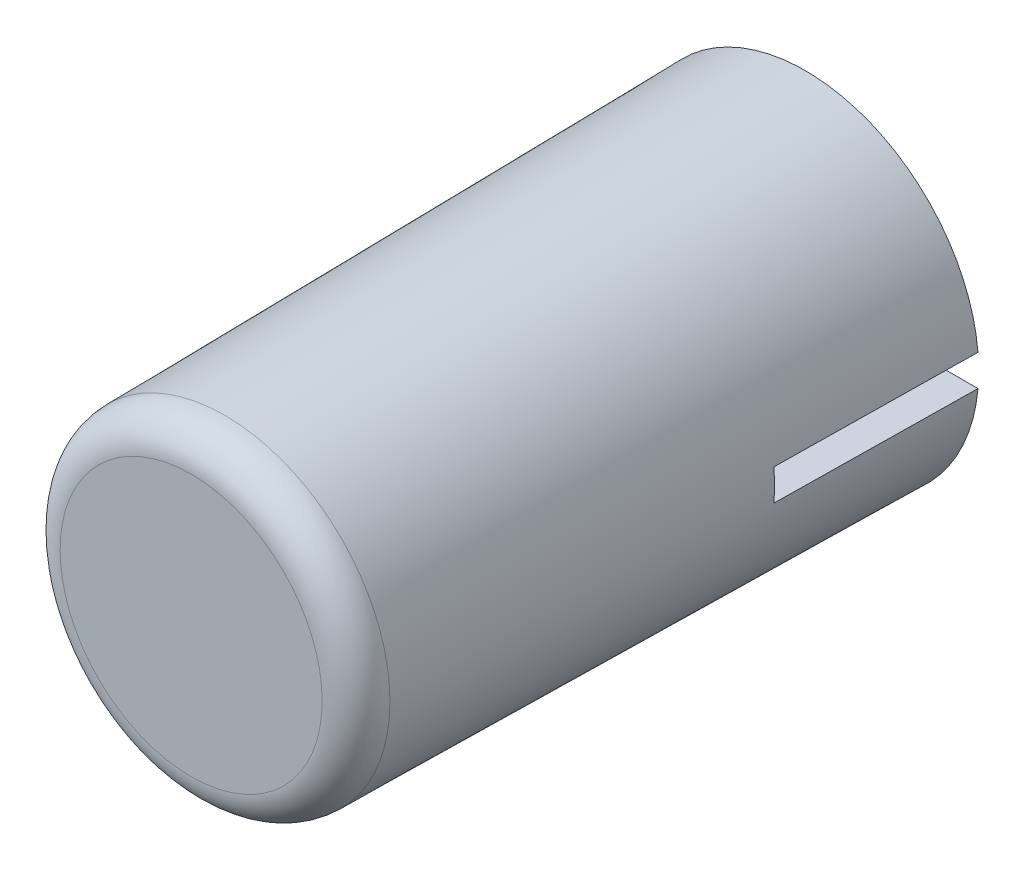
ISO-10303-21;
HEADER;
FILE_DESCRIPTION(('STEP AP214'),'2;1');
FILE_NAME('part.step','',(''),(''),'','','');
FILE_SCHEMA(('AUTOMOTIVE_DESIGN { 1 0 10303 214 1 1 1 1 }'));
ENDSEC;
DATA;
#1=APPLICATION_CONTEXT('core data for automotive mechanical design processes');
#2=APPLICATION_PROTOCOL_DEFINITION('international standard','automotive_design',2000,#1);
#3=PRODUCT_CONTEXT('',#1,'mechanical');
#4=PRODUCT('Part','Part','',(#3));
#5=PRODUCT_RELATED_PRODUCT_CATEGORY('part','',(#4));
#6=PRODUCT_DEFINITION_FORMATION('','',#4);
#7=PRODUCT_DEFINITION_CONTEXT('part definition',#1,'design');
#8=PRODUCT_DEFINITION('design','',#6,#7);
#9=PRODUCT_DEFINITION_SHAPE('','',#8);
#10=(LENGTH_UNIT() NAMED_UNIT(*) SI_UNIT(.MILLI.,.METRE.));
#11=(NAMED_UNIT(*) PLANE_ANGLE_UNIT() SI_UNIT($,.RADIAN.));
#12=(NAMED_UNIT(*) SI_UNIT($,.STERADIAN.) SOLID_ANGLE_UNIT());
#13=UNCERTAINTY_MEASURE_WITH_UNIT(LENGTH_MEASURE(1.E-05),#10,'distance_accuracy_value','');
#14=(GEOMETRIC_REPRESENTATION_CONTEXT(3) GLOBAL_UNCERTAINTY_ASSIGNED_CONTEXT((#13)) GLOBAL_UNIT_ASSIGNED_CONTEXT((#10,
#11,#12)) REPRESENTATION_CONTEXT('',''));
#15=CARTESIAN_POINT('',(0.,0.,0.));
#16=DIRECTION('',(0.,0.,1.));
#17=DIRECTION('',(1.,0.,0.));
#18=AXIS2_PLACEMENT_3D('',#15,#16,#17);
#19=CARTESIAN_POINT('',(0.,1.3335,1.2446));
#20=DIRECTION('',(0.,-1.,0.));
#21=DIRECTION('',(0.,0.,-1.));
#22=AXIS2_PLACEMENT_3D('',#19,#20,#21);
#23=PLANE('',#22);
#24=DIRECTION('',(0.,0.,-1.));
#25=VECTOR('',#24,1.);
#26=CARTESIAN_POINT('',(-1.4224,1.3335,1.2446));
#27=LINE('',#26,#25);
#28=CARTESIAN_POINT('',(-1.4224,1.3335,1.7526));
#29=VERTEX_POINT('',#28);
#30=CARTESIAN_POINT('',(-1.4224,1.3335,1.2446));
#31=VERTEX_POINT('',#30);
#32=EDGE_CURVE('E168',#29,#31,#27,.T.);
#33=ORIENTED_EDGE('',*,*,#32,.T.);
#34=DIRECTION('',(1.,0.,0.));
#35=VECTOR('',#34,1.);
#36=CARTESIAN_POINT('',(0.,1.3335,1.2446));
#37=LINE('',#36,#35);
#38=CARTESIAN_POINT('',(1.4224,1.3335,1.2446));
#39=VERTEX_POINT('',#38);
#40=EDGE_CURVE('E165',#39,#31,#37,.F.);
#41=ORIENTED_EDGE('',*,*,#40,.F.);
#42=DIRECTION('',(0.,0.,-1.));
#43=VECTOR('',#42,1.);
#44=CARTESIAN_POINT('',(1.4224,1.3335,1.2446));
#45=LINE('',#44,#43);
#46=CARTESIAN_POINT('',(1.4224,1.3335,1.7526));
#47=VERTEX_POINT('',#46);
#48=EDGE_CURVE('E147',#39,#47,#45,.F.);
#49=ORIENTED_EDGE('',*,*,#48,.T.);
#50=DIRECTION('',(1.,0.,0.));
#51=VECTOR('',#50,1.);
#52=CARTESIAN_POINT('',(0.,1.3335,1.7526));
#53=LINE('',#52,#51);
#54=EDGE_CURVE('E162',#29,#47,#53,.T.);
#55=ORIENTED_EDGE('',*,*,#54,.F.);
#56=EDGE_LOOP('',(#33,#41,#49,#55));
#57=FACE_BOUND('',#56,.T.);
#58=ADVANCED_FACE('F17',(#57),#23,.T.);
#59=CARTESIAN_POINT('',(-0.8024,-0.4953,8.43));
#60=DIRECTION('',(1.,0.,0.));
#61=DIRECTION('',(0.,0.,-1.));
#62=AXIS2_PLACEMENT_3D('',#59,#60,#61);
#63=PLANE('',#62);
#64=DIRECTION('',(0.,1.,0.));
#65=VECTOR('',#64,1.);
#66=CARTESIAN_POINT('',(-0.8024,0.,8.43));
#67=LINE('',#66,#65);
#68=CARTESIAN_POINT('',(-0.8024,0.4953,8.43));
#69=VERTEX_POINT('',#68);
#70=CARTESIAN_POINT('',(-0.8024,-0.4953,8.43));
#71=VERTEX_POINT('',#70);
#72=EDGE_CURVE('E529',#69,#71,#67,.F.);
#73=ORIENTED_EDGE('',*,*,#72,.T.);
#74=DIRECTION('',(0.,0.,-1.));
#75=VECTOR('',#74,1.);
#76=CARTESIAN_POINT('',(-0.8024,-0.4953,8.43));
#77=LINE('',#76,#75);
#78=CARTESIAN_POINT('',(-0.8024,-0.4953,3.91));
#79=VERTEX_POINT('',#78);
#80=EDGE_CURVE('E514',#79,#71,#77,.F.);
#81=ORIENTED_EDGE('',*,*,#80,.F.);
#82=DIRECTION('',(0.,1.,0.));
#83=VECTOR('',#82,1.);
#84=CARTESIAN_POINT('',(-0.8024,0.,3.91));
#85=LINE('',#84,#83);
#86=CARTESIAN_POINT('',(-0.8024,0.4953,3.91));
#87=VERTEX_POINT('',#86);
#88=EDGE_CURVE('E507',#79,#87,#85,.T.);
#89=ORIENTED_EDGE('',*,*,#88,.T.);
#90=DIRECTION('',(0.,0.,1.));
#91=VECTOR('',#90,1.);
#92=CARTESIAN_POINT('',(-0.8024,0.4953,8.43));
#93=LINE('',#92,#91);
#94=EDGE_CURVE('E479',#69,#87,#93,.F.);
#95=ORIENTED_EDGE('',*,*,#94,.F.);
#96=EDGE_LOOP('',(#73,#81,#89,#95));
#97=FACE_BOUND('',#96,.T.);
#98=ADVANCED_FACE('F888',(#97),#63,.T.);
#99=CARTESIAN_POINT('',(0.,-1.3335,1.7526));
#100=DIRECTION('',(0.,1.,0.));
#101=DIRECTION('',(0.,0.,1.));
#102=AXIS2_PLACEMENT_3D('',#99,#100,#101);
#103=PLANE('',#102);
#104=DIRECTION('',(0.,0.,1.));
#105=VECTOR('',#104,1.);
#106=CARTESIAN_POINT('',(-1.4224,-1.3335,1.7526));
#107=LINE('',#106,#105);
#108=CARTESIAN_POINT('',(-1.4224,-1.3335,1.2446));
#109=VERTEX_POINT('',#108);
#110=CARTESIAN_POINT('',(-1.4224,-1.3335,1.7526));
#111=VERTEX_POINT('',#110);
#112=EDGE_CURVE('E158',#109,#111,#107,.T.);
#113=ORIENTED_EDGE('',*,*,#112,.T.);
#114=DIRECTION('',(1.,0.,0.));
#115=VECTOR('',#114,1.);
#116=CARTESIAN_POINT('',(0.,-1.3335,1.7526));
#117=LINE('',#116,#115);
#118=CARTESIAN_POINT('',(1.4224,-1.3335,1.7526));
#119=VERTEX_POINT('',#118);
#120=EDGE_CURVE('E570',#119,#111,#117,.F.);
#121=ORIENTED_EDGE('',*,*,#120,.F.);
#122=DIRECTION('',(0.,0.,1.));
#123=VECTOR('',#122,1.);
#124=CARTESIAN_POINT('',(1.4224,-1.3335,1.7526));
#125=LINE('',#124,#123);
#126=CARTESIAN_POINT('',(1.4224,-1.3335,1.2446));
#127=VERTEX_POINT('',#126);
#128=EDGE_CURVE('E549',#119,#127,#125,.F.);
#129=ORIENTED_EDGE('',*,*,#128,.T.);
#130=DIRECTION('',(1.,0.,0.));
#131=VECTOR('',#130,1.);
#132=CARTESIAN_POINT('',(0.,-1.3335,1.2446));
#133=LINE('',#132,#131);
#134=EDGE_CURVE('E465',#109,#127,#133,.T.);
#135=ORIENTED_EDGE('',*,*,#134,.F.);
#136=EDGE_LOOP('',(#113,#121,#129,#135));
#137=FACE_BOUND('',#136,.T.);
#138=ADVANCED_FACE('F881',(#137),#103,.T.);
#139=CARTESIAN_POINT('',(0.,1.3335,1.7526));
#140=DIRECTION('',(0.,-0.342020143325671,0.939692620785908));
#141=DIRECTION('',(0.,-0.939692620785908,-0.342020143325671));
#142=AXIS2_PLACEMENT_3D('',#139,#140,#141);
#143=PLANE('',#142);
#144=DIRECTION('',(0.,-0.939692620785908,-0.342020143325671));
#145=VECTOR('',#144,1.);
#146=CARTESIAN_POINT('',(-1.4224,1.3335,1.7526));
#147=LINE('',#146,#145);
#148=CARTESIAN_POINT('',(-1.4224,1.4224,1.78495695382627));
#149=VERTEX_POINT('',#148);
#150=EDGE_CURVE('E157',#149,#29,#147,.T.);
#151=ORIENTED_EDGE('',*,*,#150,.T.);
#152=ORIENTED_EDGE('',*,*,#54,.T.);
#153=DIRECTION('',(0.,-0.939692620785908,-0.342020143325671));
#154=VECTOR('',#153,1.);
#155=CARTESIAN_POINT('',(1.4224,1.3335,1.7526));
#156=LINE('',#155,#154);
#157=CARTESIAN_POINT('',(1.4224,1.4224,1.78495695382627));
#158=VERTEX_POINT('',#157);
#159=EDGE_CURVE('E144',#47,#158,#156,.F.);
#160=ORIENTED_EDGE('',*,*,#159,.T.);
#161=DIRECTION('',(1.,0.,0.));
#162=VECTOR('',#161,1.);
#163=CARTESIAN_POINT('',(-1.4224,1.4224,1.78495695382627));
#164=LINE('',#163,#162);
#165=EDGE_CURVE('E458',#158,#149,#164,.F.);
#166=ORIENTED_EDGE('',*,*,#165,.T.);
#167=EDGE_LOOP('',(#151,#152,#160,#166));
#168=FACE_BOUND('',#167,.T.);
#169=ADVANCED_FACE('F170',(#168),#143,.T.);
#170=CARTESIAN_POINT('',(0.8024,0.4953,8.43));
#171=DIRECTION('',(-1.,0.,0.));
#172=DIRECTION('',(0.,0.,1.));
#173=AXIS2_PLACEMENT_3D('',#170,#171,#172);
#174=PLANE('',#173);
#175=DIRECTION('',(0.,1.,0.));
#176=VECTOR('',#175,1.);
#177=CARTESIAN_POINT('',(0.8024,0.,8.43));
#178=LINE('',#177,#176);
#179=CARTESIAN_POINT('',(0.8024,-0.4953,8.43));
#180=VERTEX_POINT('',#179);
#181=CARTESIAN_POINT('',(0.8024,0.4953,8.43));
#182=VERTEX_POINT('',#181);
#183=EDGE_CURVE('E540',#180,#182,#178,.T.);
#184=ORIENTED_EDGE('',*,*,#183,.T.);
#185=DIRECTION('',(0.,0.,1.));
#186=VECTOR('',#185,1.);
#187=CARTESIAN_POINT('',(0.8024,0.4953,8.43));
#188=LINE('',#187,#186);
#189=CARTESIAN_POINT('',(0.8024,0.4953,3.91));
#190=VERTEX_POINT('',#189);
#191=EDGE_CURVE('E454',#190,#182,#188,.T.);
#192=ORIENTED_EDGE('',*,*,#191,.F.);
#193=DIRECTION('',(0.,1.,0.));
#194=VECTOR('',#193,1.);
#195=CARTESIAN_POINT('',(0.8024,0.,3.91));
#196=LINE('',#195,#194);
#197=CARTESIAN_POINT('',(0.8024,-0.4953,3.91));
#198=VERTEX_POINT('',#197);
#199=EDGE_CURVE('E442',#190,#198,#196,.F.);
#200=ORIENTED_EDGE('',*,*,#199,.T.);
#201=DIRECTION('',(0.,0.,-1.));
#202=VECTOR('',#201,1.);
#203=CARTESIAN_POINT('',(0.8024,-0.4953,8.43));
#204=LINE('',#203,#202);
#205=EDGE_CURVE('E430',#180,#198,#204,.T.);
#206=ORIENTED_EDGE('',*,*,#205,.F.);
#207=EDGE_LOOP('',(#184,#192,#200,#206));
#208=FACE_BOUND('',#207,.T.);
#209=ADVANCED_FACE('F866',(#208),#174,.T.);
#210=CARTESIAN_POINT('',(0.,0.,8.43));
#211=DIRECTION('',(0.,0.,1.));
#212=DIRECTION('',(1.,0.,0.));
#213=AXIS2_PLACEMENT_3D('',#210,#211,#212);
#214=PLANE('',#213);
#215=ORIENTED_EDGE('',*,*,#72,.F.);
#216=DIRECTION('',(1.,0.,0.));
#217=VECTOR('',#216,1.);
#218=CARTESIAN_POINT('',(-0.8024,0.4953,8.43));
#219=LINE('',#218,#217);
#220=CARTESIAN_POINT('',(-1.4224,0.4953,8.43));
#221=VERTEX_POINT('',#220);
#222=EDGE_CURVE('E495',#221,#69,#219,.T.);
#223=ORIENTED_EDGE('',*,*,#222,.F.);
#224=DIRECTION('',(0.,1.,0.));
#225=VECTOR('',#224,1.);
#226=CARTESIAN_POINT('',(-1.4224,0.,8.43));
#227=LINE('',#226,#225);
#228=CARTESIAN_POINT('',(-1.4224,1.4224,8.43));
#229=VERTEX_POINT('',#228);
#230=EDGE_CURVE('E533',#229,#221,#227,.F.);
#231=ORIENTED_EDGE('',*,*,#230,.F.);
#232=DIRECTION('',(1.,0.,0.));
#233=VECTOR('',#232,1.);
#234=CARTESIAN_POINT('',(-1.4224,1.4224,8.43));
#235=LINE('',#234,#233);
#236=CARTESIAN_POINT('',(1.4224,1.4224,8.43));
#237=VERTEX_POINT('',#236);
#238=EDGE_CURVE('E461',#229,#237,#235,.T.);
#239=ORIENTED_EDGE('',*,*,#238,.T.);
#240=DIRECTION('',(0.,1.,0.));
#241=VECTOR('',#240,1.);
#242=CARTESIAN_POINT('',(1.4224,0.,8.43));
#243=LINE('',#242,#241);
#244=CARTESIAN_POINT('',(1.4224,0.4953,8.43));
#245=VERTEX_POINT('',#244);
#246=EDGE_CURVE('E537',#245,#237,#243,.T.);
#247=ORIENTED_EDGE('',*,*,#246,.F.);
#248=DIRECTION('',(1.,0.,0.));
#249=VECTOR('',#248,1.);
#250=CARTESIAN_POINT('',(1.4224,0.4953,8.43));
#251=LINE('',#250,#249);
#252=EDGE_CURVE('E450',#182,#245,#251,.T.);
#253=ORIENTED_EDGE('',*,*,#252,.F.);
#254=ORIENTED_EDGE('',*,*,#183,.F.);
#255=DIRECTION('',(1.,0.,0.));
#256=VECTOR('',#255,1.);
#257=CARTESIAN_POINT('',(0.8024,-0.4953,8.43));
#258=LINE('',#257,#256);
#259=CARTESIAN_POINT('',(1.4224,-0.4953,8.43));
#260=VERTEX_POINT('',#259);
#261=EDGE_CURVE('E434',#260,#180,#258,.F.);
#262=ORIENTED_EDGE('',*,*,#261,.F.);
#263=DIRECTION('',(0.,1.,0.));
#264=VECTOR('',#263,1.);
#265=CARTESIAN_POINT('',(1.4224,0.,8.43));
#266=LINE('',#265,#264);
#267=CARTESIAN_POINT('',(1.4224,-1.4224,8.43));
#268=VERTEX_POINT('',#267);
#269=EDGE_CURVE('E179',#268,#260,#266,.T.);
#270=ORIENTED_EDGE('',*,*,#269,.F.);
#271=DIRECTION('',(1.,0.,0.));
#272=VECTOR('',#271,1.);
#273=CARTESIAN_POINT('',(1.4224,-1.4224,8.43));
#274=LINE('',#273,#272);
#275=CARTESIAN_POINT('',(-1.4224,-1.4224,8.43));
#276=VERTEX_POINT('',#275);
#277=EDGE_CURVE('E426',#268,#276,#274,.F.);
#278=ORIENTED_EDGE('',*,*,#277,.T.);
#279=DIRECTION('',(0.,1.,0.));
#280=VECTOR('',#279,1.);
#281=CARTESIAN_POINT('',(-1.4224,0.,8.43));
#282=LINE('',#281,#280);
#283=CARTESIAN_POINT('',(-1.4224,-0.4953,8.43));
#284=VERTEX_POINT('',#283);
#285=EDGE_CURVE('E173',#284,#276,#282,.F.);
#286=ORIENTED_EDGE('',*,*,#285,.F.);
#287=DIRECTION('',(1.,0.,0.));
#288=VECTOR('',#287,1.);
#289=CARTESIAN_POINT('',(-1.4224,-0.4953,8.43));
#290=LINE('',#289,#288);
#291=EDGE_CURVE('E510',#71,#284,#290,.F.);
#292=ORIENTED_EDGE('',*,*,#291,.F.);
#293=EDGE_LOOP('',(#215,#223,#231,#239,#247,#253,#254,#262,#270,#278,#286,#292));
#294=FACE_BOUND('',#293,.T.);
#295=ADVANCED_FACE('F859',(#294),#214,.F.);
#296=CARTESIAN_POINT('',(0.,-1.4224,1.78495695382627));
#297=DIRECTION('',(0.,0.342020143325668,0.939692620785909));
#298=DIRECTION('',(0.,-0.939692620785909,0.342020143325668));
#299=AXIS2_PLACEMENT_3D('',#296,#297,#298);
#300=PLANE('',#299);
#301=DIRECTION('',(0.,-0.939692620785909,0.342020143325668));
#302=VECTOR('',#301,1.);
#303=CARTESIAN_POINT('',(-1.4224,-1.4224,1.78495695382627));
#304=LINE('',#303,#302);
#305=CARTESIAN_POINT('',(-1.4224,-1.4224,1.78495695382627));
#306=VERTEX_POINT('',#305);
#307=EDGE_CURVE('E526',#111,#306,#304,.T.);
#308=ORIENTED_EDGE('',*,*,#307,.T.);
#309=DIRECTION('',(1.,0.,0.));
#310=VECTOR('',#309,1.);
#311=CARTESIAN_POINT('',(1.4224,-1.4224,1.78495695382627));
#312=LINE('',#311,#310);
#313=CARTESIAN_POINT('',(1.4224,-1.4224,1.78495695382627));
#314=VERTEX_POINT('',#313);
#315=EDGE_CURVE('E422',#306,#314,#312,.T.);
#316=ORIENTED_EDGE('',*,*,#315,.T.);
#317=DIRECTION('',(0.,-0.939692620785909,0.342020143325668));
#318=VECTOR('',#317,1.);
#319=CARTESIAN_POINT('',(1.4224,-1.4224,1.78495695382627));
#320=LINE('',#319,#318);
#321=EDGE_CURVE('E532',#314,#119,#320,.F.);
#322=ORIENTED_EDGE('',*,*,#321,.T.);
#323=ORIENTED_EDGE('',*,*,#120,.T.);
#324=EDGE_LOOP('',(#308,#316,#322,#323));
#325=FACE_BOUND('',#324,.T.);
#326=ADVANCED_FACE('F581',(#325),#300,.T.);
#327=CARTESIAN_POINT('',(0.,1.4224,1.21224304617374));
#328=DIRECTION('',(0.,-0.342020143325667,-0.939692620785909));
#329=DIRECTION('',(0.,0.939692620785909,-0.342020143325667));
#330=AXIS2_PLACEMENT_3D('',#327,#328,#329);
#331=PLANE('',#330);
#332=DIRECTION('',(0.,0.939692620785909,-0.342020143325667));
#333=VECTOR('',#332,1.);
#334=CARTESIAN_POINT('',(-1.4224,1.4224,1.21224304617374));
#335=LINE('',#334,#333);
#336=CARTESIAN_POINT('',(-1.4224,1.4224,1.21224304617374));
#337=VERTEX_POINT('',#336);
#338=EDGE_CURVE('E518',#31,#337,#335,.T.);
#339=ORIENTED_EDGE('',*,*,#338,.T.);
#340=DIRECTION('',(1.,0.,0.));
#341=VECTOR('',#340,1.);
#342=CARTESIAN_POINT('',(-1.4224,1.4224,1.21224304617374));
#343=LINE('',#342,#341);
#344=CARTESIAN_POINT('',(1.4224,1.4224,1.21224304617374));
#345=VERTEX_POINT('',#344);
#346=EDGE_CURVE('E383',#337,#345,#343,.T.);
#347=ORIENTED_EDGE('',*,*,#346,.T.);
#348=DIRECTION('',(0.,0.939692620785909,-0.342020143325667));
#349=VECTOR('',#348,1.);
#350=CARTESIAN_POINT('',(1.4224,1.4224,1.21224304617374));
#351=LINE('',#350,#349);
#352=EDGE_CURVE('E523',#345,#39,#351,.F.);
#353=ORIENTED_EDGE('',*,*,#352,.T.);
#354=ORIENTED_EDGE('',*,*,#40,.T.);
#355=EDGE_LOOP('',(#339,#347,#353,#354));
#356=FACE_BOUND('',#355,.T.);
#357=ADVANCED_FACE('F844',(#356),#331,.T.);
#358=CARTESIAN_POINT('',(-1.4224,-0.4953,8.43));
#359=DIRECTION('',(0.,-1.,0.));
#360=DIRECTION('',(0.,0.,-1.));
#361=AXIS2_PLACEMENT_3D('',#358,#359,#360);
#362=PLANE('',#361);
#363=ORIENTED_EDGE('',*,*,#291,.T.);
#364=DIRECTION('',(0.,0.,1.));
#365=VECTOR('',#364,1.);
#366=CARTESIAN_POINT('',(-1.4224,-0.4953,0.));
#367=LINE('',#366,#365);
#368=CARTESIAN_POINT('',(-1.4224,-0.4953,3.91));
#369=VERTEX_POINT('',#368);
#370=EDGE_CURVE('E375',#284,#369,#367,.F.);
#371=ORIENTED_EDGE('',*,*,#370,.T.);
#372=DIRECTION('',(1.,0.,0.));
#373=VECTOR('',#372,1.);
#374=CARTESIAN_POINT('',(-1.1124,-0.4953,3.91));
#375=LINE('',#374,#373);
#376=EDGE_CURVE('E503',#369,#79,#375,.T.);
#377=ORIENTED_EDGE('',*,*,#376,.T.);
#378=ORIENTED_EDGE('',*,*,#80,.T.);
#379=EDGE_LOOP('',(#363,#371,#377,#378));
#380=FACE_BOUND('',#379,.T.);
#381=ADVANCED_FACE('F836',(#380),#362,.T.);
#382=CARTESIAN_POINT('',(-1.1124,0.,3.91));
#383=DIRECTION('',(0.,0.,1.));
#384=DIRECTION('',(1.,0.,0.));
#385=AXIS2_PLACEMENT_3D('',#382,#383,#384);
#386=PLANE('',#385);
#387=DIRECTION('',(0.,1.,0.));
#388=VECTOR('',#387,1.);
#389=CARTESIAN_POINT('',(-1.4224,-1.4224,3.91));
#390=LINE('',#389,#388);
#391=CARTESIAN_POINT('',(-1.4224,0.4953,3.91));
#392=VERTEX_POINT('',#391);
#393=EDGE_CURVE('E371',#369,#392,#390,.T.);
#394=ORIENTED_EDGE('',*,*,#393,.T.);
#395=DIRECTION('',(1.,0.,0.));
#396=VECTOR('',#395,1.);
#397=CARTESIAN_POINT('',(-0.8024,0.4953,3.91));
#398=LINE('',#397,#396);
#399=EDGE_CURVE('E499',#87,#392,#398,.F.);
#400=ORIENTED_EDGE('',*,*,#399,.F.);
#401=ORIENTED_EDGE('',*,*,#88,.F.);
#402=ORIENTED_EDGE('',*,*,#376,.F.);
#403=EDGE_LOOP('',(#394,#400,#401,#402));
#404=FACE_BOUND('',#403,.T.);
#405=ADVANCED_FACE('F828',(#404),#386,.F.);
#406=CARTESIAN_POINT('',(-0.8024,0.4953,8.43));
#407=DIRECTION('',(0.,1.,0.));
#408=DIRECTION('',(0.,0.,1.));
#409=AXIS2_PLACEMENT_3D('',#406,#407,#408);
#410=PLANE('',#409);
#411=ORIENTED_EDGE('',*,*,#222,.T.);
#412=ORIENTED_EDGE('',*,*,#94,.T.);
#413=ORIENTED_EDGE('',*,*,#399,.T.);
#414=DIRECTION('',(0.,0.,1.));
#415=VECTOR('',#414,1.);
#416=CARTESIAN_POINT('',(-1.4224,0.4953,0.));
#417=LINE('',#416,#415);
#418=EDGE_CURVE('E367',#392,#221,#417,.T.);
#419=ORIENTED_EDGE('',*,*,#418,.T.);
#420=EDGE_LOOP('',(#411,#412,#413,#419));
#421=FACE_BOUND('',#420,.T.);
#422=ADVANCED_FACE('F820',(#421),#410,.T.);
#423=CARTESIAN_POINT('',(0.,-1.3335,1.2446));
#424=DIRECTION('',(0.,0.342020143325671,-0.939692620785908));
#425=DIRECTION('',(0.,0.939692620785908,0.342020143325671));
#426=AXIS2_PLACEMENT_3D('',#423,#424,#425);
#427=PLANE('',#426);
#428=DIRECTION('',(0.,0.93969262078591,0.342020143325664));
#429=VECTOR('',#428,1.);
#430=CARTESIAN_POINT('',(-1.4224,-1.4224,1.21224304617374));
#431=LINE('',#430,#429);
#432=CARTESIAN_POINT('',(-1.4224,-1.4224,1.21224304617374));
#433=VERTEX_POINT('',#432);
#434=EDGE_CURVE('E344',#433,#109,#431,.T.);
#435=ORIENTED_EDGE('',*,*,#434,.T.);
#436=ORIENTED_EDGE('',*,*,#134,.T.);
#437=DIRECTION('',(0.,0.939692620785908,0.342020143325671));
#438=VECTOR('',#437,1.);
#439=CARTESIAN_POINT('',(1.4224,-1.3335,1.2446));
#440=LINE('',#439,#438);
#441=CARTESIAN_POINT('',(1.4224,-1.4224,1.21224304617373));
#442=VERTEX_POINT('',#441);
#443=EDGE_CURVE('E476',#127,#442,#440,.F.);
#444=ORIENTED_EDGE('',*,*,#443,.T.);
#445=DIRECTION('',(1.,0.,0.));
#446=VECTOR('',#445,1.);
#447=CARTESIAN_POINT('',(1.4224,-1.4224,1.21224304617374));
#448=LINE('',#447,#446);
#449=EDGE_CURVE('E331',#442,#433,#448,.F.);
#450=ORIENTED_EDGE('',*,*,#449,.T.);
#451=EDGE_LOOP('',(#435,#436,#444,#450));
#452=FACE_BOUND('',#451,.T.);
#453=ADVANCED_FACE('F812',(#452),#427,.T.);
#454=CARTESIAN_POINT('',(-1.4224,1.4224,0.));
#455=DIRECTION('',(0.,1.,0.));
#456=DIRECTION('',(0.,0.,1.));
#457=AXIS2_PLACEMENT_3D('',#454,#455,#456);
#458=PLANE('',#457);
#459=DIRECTION('',(0.,0.,-1.));
#460=VECTOR('',#459,1.);
#461=CARTESIAN_POINT('',(1.4224,1.4224,0.));
#462=LINE('',#461,#460);
#463=EDGE_CURVE('E151',#158,#237,#462,.F.);
#464=ORIENTED_EDGE('',*,*,#463,.T.);
#465=ORIENTED_EDGE('',*,*,#238,.F.);
#466=DIRECTION('',(0.,0.,1.));
#467=VECTOR('',#466,1.);
#468=CARTESIAN_POINT('',(-1.4224,1.4224,0.));
#469=LINE('',#468,#467);
#470=EDGE_CURVE('E362',#229,#149,#469,.F.);
#471=ORIENTED_EDGE('',*,*,#470,.T.);
#472=ORIENTED_EDGE('',*,*,#165,.F.);
#473=EDGE_LOOP('',(#464,#465,#471,#472));
#474=FACE_BOUND('',#473,.T.);
#475=ADVANCED_FACE('F804',(#474),#458,.F.);
#476=CARTESIAN_POINT('',(1.4224,0.4953,8.43));
#477=DIRECTION('',(0.,1.,0.));
#478=DIRECTION('',(0.,0.,1.));
#479=AXIS2_PLACEMENT_3D('',#476,#477,#478);
#480=PLANE('',#479);
#481=ORIENTED_EDGE('',*,*,#252,.T.);
#482=DIRECTION('',(0.,0.,-1.));
#483=VECTOR('',#482,1.);
#484=CARTESIAN_POINT('',(1.4224,0.4953,0.));
#485=LINE('',#484,#483);
#486=CARTESIAN_POINT('',(1.4224,0.4953,3.91));
#487=VERTEX_POINT('',#486);
#488=EDGE_CURVE('E317',#245,#487,#485,.T.);
#489=ORIENTED_EDGE('',*,*,#488,.T.);
#490=DIRECTION('',(1.,0.,0.));
#491=VECTOR('',#490,1.);
#492=CARTESIAN_POINT('',(1.1124,0.4953,3.91));
#493=LINE('',#492,#491);
#494=EDGE_CURVE('E446',#487,#190,#493,.F.);
#495=ORIENTED_EDGE('',*,*,#494,.T.);
#496=ORIENTED_EDGE('',*,*,#191,.T.);
#497=EDGE_LOOP('',(#481,#489,#495,#496));
#498=FACE_BOUND('',#497,.T.);
#499=ADVANCED_FACE('F796',(#498),#480,.T.);
#500=CARTESIAN_POINT('',(1.1124,0.,3.91));
#501=DIRECTION('',(0.,0.,1.));
#502=DIRECTION('',(1.,0.,0.));
#503=AXIS2_PLACEMENT_3D('',#500,#501,#502);
#504=PLANE('',#503);
#505=DIRECTION('',(1.,0.,0.));
#506=VECTOR('',#505,1.);
#507=CARTESIAN_POINT('',(0.8024,-0.4953,3.91));
#508=LINE('',#507,#506);
#509=CARTESIAN_POINT('',(1.4224,-0.4953,3.91));
#510=VERTEX_POINT('',#509);
#511=EDGE_CURVE('E438',#198,#510,#508,.T.);
#512=ORIENTED_EDGE('',*,*,#511,.F.);
#513=ORIENTED_EDGE('',*,*,#199,.F.);
#514=ORIENTED_EDGE('',*,*,#494,.F.);
#515=DIRECTION('',(0.,1.,0.));
#516=VECTOR('',#515,1.);
#517=CARTESIAN_POINT('',(1.4224,1.4224,3.91));
#518=LINE('',#517,#516);
#519=EDGE_CURVE('E313',#487,#510,#518,.F.);
#520=ORIENTED_EDGE('',*,*,#519,.T.);
#521=EDGE_LOOP('',(#512,#513,#514,#520));
#522=FACE_BOUND('',#521,.T.);
#523=ADVANCED_FACE('F788',(#522),#504,.F.);
#524=CARTESIAN_POINT('',(0.8024,-0.4953,8.43));
#525=DIRECTION('',(0.,-1.,0.));
#526=DIRECTION('',(0.,0.,-1.));
#527=AXIS2_PLACEMENT_3D('',#524,#525,#526);
#528=PLANE('',#527);
#529=ORIENTED_EDGE('',*,*,#261,.T.);
#530=ORIENTED_EDGE('',*,*,#205,.T.);
#531=ORIENTED_EDGE('',*,*,#511,.T.);
#532=DIRECTION('',(0.,0.,-1.));
#533=VECTOR('',#532,1.);
#534=CARTESIAN_POINT('',(1.4224,-0.4953,0.));
#535=LINE('',#534,#533);
#536=EDGE_CURVE('E309',#510,#260,#535,.F.);
#537=ORIENTED_EDGE('',*,*,#536,.T.);
#538=EDGE_LOOP('',(#529,#530,#531,#537));
#539=FACE_BOUND('',#538,.T.);
#540=ADVANCED_FACE('F780',(#539),#528,.T.);
#541=CARTESIAN_POINT('',(1.4224,-1.4224,0.));
#542=DIRECTION('',(0.,-1.,0.));
#543=DIRECTION('',(0.,0.,-1.));
#544=AXIS2_PLACEMENT_3D('',#541,#542,#543);
#545=PLANE('',#544);
#546=DIRECTION('',(0.,0.,1.));
#547=VECTOR('',#546,1.);
#548=CARTESIAN_POINT('',(-1.4224,-1.4224,0.));
#549=LINE('',#548,#547);
#550=EDGE_CURVE('E379',#306,#276,#549,.T.);
#551=ORIENTED_EDGE('',*,*,#550,.T.);
#552=ORIENTED_EDGE('',*,*,#277,.F.);
#553=DIRECTION('',(0.,0.,-1.));
#554=VECTOR('',#553,1.);
#555=CARTESIAN_POINT('',(1.4224,-1.4224,0.));
#556=LINE('',#555,#554);
#557=EDGE_CURVE('E297',#268,#314,#556,.T.);
#558=ORIENTED_EDGE('',*,*,#557,.T.);
#559=ORIENTED_EDGE('',*,*,#315,.F.);
#560=EDGE_LOOP('',(#551,#552,#558,#559));
#561=FACE_BOUND('',#560,.T.);
#562=ADVANCED_FACE('F773',(#561),#545,.F.);
#563=CARTESIAN_POINT('',(-1.4224,1.4224,0.));
#564=DIRECTION('',(0.,1.,0.));
#565=DIRECTION('',(0.,0.,1.));
#566=AXIS2_PLACEMENT_3D('',#563,#564,#565);
#567=PLANE('',#566);
#568=DIRECTION('',(0.,0.,1.));
#569=VECTOR('',#568,1.);
#570=CARTESIAN_POINT('',(-1.4224,1.4224,0.));
#571=LINE('',#570,#569);
#572=CARTESIAN_POINT('',(-1.4224,1.4224,0.));
#573=VERTEX_POINT('',#572);
#574=EDGE_CURVE('E366',#337,#573,#571,.F.);
#575=ORIENTED_EDGE('',*,*,#574,.T.);
#576=DIRECTION('',(-1.,0.,0.));
#577=VECTOR('',#576,1.);
#578=CARTESIAN_POINT('',(0.,1.4224,0.));
#579=LINE('',#578,#577);
#580=CARTESIAN_POINT('',(1.4224,1.4224,0.));
#581=VERTEX_POINT('',#580);
#582=EDGE_CURVE('E399',#581,#573,#579,.T.);
#583=ORIENTED_EDGE('',*,*,#582,.F.);
#584=DIRECTION('',(0.,0.,-1.));
#585=VECTOR('',#584,1.);
#586=CARTESIAN_POINT('',(1.4224,1.4224,0.));
#587=LINE('',#586,#585);
#588=EDGE_CURVE('E323',#581,#345,#587,.F.);
#589=ORIENTED_EDGE('',*,*,#588,.T.);
#590=ORIENTED_EDGE('',*,*,#346,.F.);
#591=EDGE_LOOP('',(#575,#583,#589,#590));
#592=FACE_BOUND('',#591,.T.);
#593=ADVANCED_FACE('F642',(#592),#567,.F.);
#594=CARTESIAN_POINT('',(-1.4224,-1.4224,0.));
#595=DIRECTION('',(-1.,0.,0.));
#596=DIRECTION('',(0.,0.,1.));
#597=AXIS2_PLACEMENT_3D('',#594,#595,#596);
#598=PLANE('',#597);
#599=ORIENTED_EDGE('',*,*,#112,.F.);
#600=ORIENTED_EDGE('',*,*,#434,.F.);
#601=DIRECTION('',(0.,0.,-1.));
#602=VECTOR('',#601,1.);
#603=CARTESIAN_POINT('',(-1.4224,-1.4224,0.));
#604=LINE('',#603,#602);
#605=CARTESIAN_POINT('',(-1.4224,-1.4224,0.));
#606=VERTEX_POINT('',#605);
#607=EDGE_CURVE('E340',#433,#606,#604,.T.);
#608=ORIENTED_EDGE('',*,*,#607,.T.);
#609=DIRECTION('',(0.,1.,0.));
#610=VECTOR('',#609,1.);
#611=CARTESIAN_POINT('',(-1.4224,-1.4224,0.));
#612=LINE('',#611,#610);
#613=CARTESIAN_POINT('',(-1.4224,-0.23,0.));
#614=VERTEX_POINT('',#613);
#615=EDGE_CURVE('E384',#614,#606,#612,.F.);
#616=ORIENTED_EDGE('',*,*,#615,.F.);
#617=DIRECTION('',(0.,0.,-1.));
#618=VECTOR('',#617,1.);
#619=CARTESIAN_POINT('',(-1.4224,-0.23,0.));
#620=LINE('',#619,#618);
#621=CARTESIAN_POINT('',(-1.4224,-0.23,2.95));
#622=VERTEX_POINT('',#621);
#623=EDGE_CURVE('E347',#614,#622,#620,.F.);
#624=ORIENTED_EDGE('',*,*,#623,.T.);
#625=DIRECTION('',(0.,1.,0.));
#626=VECTOR('',#625,1.);
#627=CARTESIAN_POINT('',(-1.4224,0.,2.95));
#628=LINE('',#627,#626);
#629=CARTESIAN_POINT('',(-1.4224,0.23,2.95));
#630=VERTEX_POINT('',#629);
#631=EDGE_CURVE('E355',#622,#630,#628,.T.);
#632=ORIENTED_EDGE('',*,*,#631,.T.);
#633=DIRECTION('',(0.,0.,1.));
#634=VECTOR('',#633,1.);
#635=CARTESIAN_POINT('',(-1.4224,0.23,0.));
#636=LINE('',#635,#634);
#637=CARTESIAN_POINT('',(-1.4224,0.23,0.));
#638=VERTEX_POINT('',#637);
#639=EDGE_CURVE('E389',#630,#638,#636,.F.);
#640=ORIENTED_EDGE('',*,*,#639,.T.);
#641=DIRECTION('',(0.,1.,0.));
#642=VECTOR('',#641,1.);
#643=CARTESIAN_POINT('',(-1.4224,0.,0.));
#644=LINE('',#643,#642);
#645=EDGE_CURVE('E393',#573,#638,#644,.F.);
#646=ORIENTED_EDGE('',*,*,#645,.F.);
#647=ORIENTED_EDGE('',*,*,#574,.F.);
#648=ORIENTED_EDGE('',*,*,#338,.F.);
#649=ORIENTED_EDGE('',*,*,#32,.F.);
#650=ORIENTED_EDGE('',*,*,#150,.F.);
#651=ORIENTED_EDGE('',*,*,#470,.F.);
#652=ORIENTED_EDGE('',*,*,#230,.T.);
#653=ORIENTED_EDGE('',*,*,#418,.F.);
#654=ORIENTED_EDGE('',*,*,#393,.F.);
#655=ORIENTED_EDGE('',*,*,#370,.F.);
#656=ORIENTED_EDGE('',*,*,#285,.T.);
#657=ORIENTED_EDGE('',*,*,#550,.F.);
#658=ORIENTED_EDGE('',*,*,#307,.F.);
#659=EDGE_LOOP('',(#599,#600,#608,#616,#624,#632,#640,#646,#647,#648,#649,#650,#651,#652,#653,
#654,#655,#656,#657,#658));
#660=FACE_BOUND('',#659,.T.);
#661=ADVANCED_FACE('F759',(#660),#598,.F.);
#662=CARTESIAN_POINT('',(1.4224,-1.4224,0.));
#663=DIRECTION('',(0.,-1.,0.));
#664=DIRECTION('',(0.,0.,-1.));
#665=AXIS2_PLACEMENT_3D('',#662,#663,#664);
#666=PLANE('',#665);
#667=DIRECTION('',(0.,0.,-1.));
#668=VECTOR('',#667,1.);
#669=CARTESIAN_POINT('',(1.4224,-1.4224,0.));
#670=LINE('',#669,#668);
#671=CARTESIAN_POINT('',(1.4224,-1.4224,0.));
#672=VERTEX_POINT('',#671);
#673=EDGE_CURVE('E326',#442,#672,#670,.T.);
#674=ORIENTED_EDGE('',*,*,#673,.T.);
#675=DIRECTION('',(-1.,0.,0.));
#676=VECTOR('',#675,1.);
#677=CARTESIAN_POINT('',(0.,-1.4224,0.));
#678=LINE('',#677,#676);
#679=EDGE_CURVE('E303',#606,#672,#678,.F.);
#680=ORIENTED_EDGE('',*,*,#679,.F.);
#681=ORIENTED_EDGE('',*,*,#607,.F.);
#682=ORIENTED_EDGE('',*,*,#449,.F.);
#683=EDGE_LOOP('',(#674,#680,#681,#682));
#684=FACE_BOUND('',#683,.T.);
#685=ADVANCED_FACE('F753',(#684),#666,.F.);
#686=CARTESIAN_POINT('',(1.4224,1.4224,0.));
#687=DIRECTION('',(1.,0.,0.));
#688=DIRECTION('',(0.,0.,-1.));
#689=AXIS2_PLACEMENT_3D('',#686,#687,#688);
#690=PLANE('',#689);
#691=ORIENTED_EDGE('',*,*,#128,.F.);
#692=ORIENTED_EDGE('',*,*,#321,.F.);
#693=ORIENTED_EDGE('',*,*,#557,.F.);
#694=ORIENTED_EDGE('',*,*,#269,.T.);
#695=ORIENTED_EDGE('',*,*,#536,.F.);
#696=ORIENTED_EDGE('',*,*,#519,.F.);
#697=ORIENTED_EDGE('',*,*,#488,.F.);
#698=ORIENTED_EDGE('',*,*,#246,.T.);
#699=ORIENTED_EDGE('',*,*,#463,.F.);
#700=ORIENTED_EDGE('',*,*,#159,.F.);
#701=ORIENTED_EDGE('',*,*,#48,.F.);
#702=ORIENTED_EDGE('',*,*,#352,.F.);
#703=ORIENTED_EDGE('',*,*,#588,.F.);
#704=DIRECTION('',(0.,1.,0.));
#705=VECTOR('',#704,1.);
#706=CARTESIAN_POINT('',(1.4224,0.,0.));
#707=LINE('',#706,#705);
#708=CARTESIAN_POINT('',(1.4224,0.23,0.));
#709=VERTEX_POINT('',#708);
#710=EDGE_CURVE('E409',#709,#581,#707,.T.);
#711=ORIENTED_EDGE('',*,*,#710,.F.);
#712=DIRECTION('',(0.,0.,1.));
#713=VECTOR('',#712,1.);
#714=CARTESIAN_POINT('',(1.4224,0.23,0.));
#715=LINE('',#714,#713);
#716=CARTESIAN_POINT('',(1.4224,0.23,2.95));
#717=VERTEX_POINT('',#716);
#718=EDGE_CURVE('E293',#709,#717,#715,.T.);
#719=ORIENTED_EDGE('',*,*,#718,.T.);
#720=DIRECTION('',(0.,1.,0.));
#721=VECTOR('',#720,1.);
#722=CARTESIAN_POINT('',(1.4224,1.4224,2.95));
#723=LINE('',#722,#721);
#724=CARTESIAN_POINT('',(1.4224,-0.23,2.95));
#725=VERTEX_POINT('',#724);
#726=EDGE_CURVE('E75',#725,#717,#723,.T.);
#727=ORIENTED_EDGE('',*,*,#726,.F.);
#728=DIRECTION('',(0.,0.,-1.));
#729=VECTOR('',#728,1.);
#730=CARTESIAN_POINT('',(1.4224,-0.23,0.));
#731=LINE('',#730,#729);
#732=CARTESIAN_POINT('',(1.4224,-0.23,0.));
#733=VERTEX_POINT('',#732);
#734=EDGE_CURVE('E281',#725,#733,#731,.T.);
#735=ORIENTED_EDGE('',*,*,#734,.T.);
#736=DIRECTION('',(0.,1.,0.));
#737=VECTOR('',#736,1.);
#738=CARTESIAN_POINT('',(1.4224,0.,0.));
#739=LINE('',#738,#737);
#740=EDGE_CURVE('E290',#672,#733,#739,.T.);
#741=ORIENTED_EDGE('',*,*,#740,.F.);
#742=ORIENTED_EDGE('',*,*,#673,.F.);
#743=ORIENTED_EDGE('',*,*,#443,.F.);
#744=EDGE_LOOP('',(#691,#692,#693,#694,#695,#696,#697,#698,#699,#700,#701,#702,#703,#711,#719,
#727,#735,#741,#742,#743));
#745=FACE_BOUND('',#744,.T.);
#746=ADVANCED_FACE('F146',(#745),#690,.F.);
#747=CARTESIAN_POINT('',(0.,0.,9.));
#748=DIRECTION('',(0.,0.,-1.));
#749=DIRECTION('',(-1.,0.,0.));
#750=AXIS2_PLACEMENT_3D('',#747,#748,#749);
#751=PLANE('',#750);
#752=CARTESIAN_POINT('',(0.,0.,9.));
#753=DIRECTION('',(0.,0.,-1.));
#754=DIRECTION('',(1.,0.,0.));
#755=AXIS2_PLACEMENT_3D('',#752,#753,#754);
#756=CIRCLE('',#755,1.91982065769273);
#757=CARTESIAN_POINT('',(1.91982065769273,0.,9.));
#758=VERTEX_POINT('',#757);
#759=EDGE_CURVE('E277',#758,#758,#756,.T.);
#760=ORIENTED_EDGE('',*,*,#759,.F.);
#761=EDGE_LOOP('',(#760));
#762=FACE_BOUND('',#761,.T.);
#763=ADVANCED_FACE('F256',(#762),#751,.F.);
#764=CARTESIAN_POINT('',(1.4224,0.23,0.));
#765=DIRECTION('',(0.,1.,0.));
#766=DIRECTION('',(0.,0.,1.));
#767=AXIS2_PLACEMENT_3D('',#764,#765,#766);
#768=PLANE('',#767);
#769=DIRECTION('',(1.,0.,0.));
#770=VECTOR('',#769,1.);
#771=CARTESIAN_POINT('',(2.07026856184627,0.23,2.95));
#772=LINE('',#771,#770);
#773=CARTESIAN_POINT('',(2.48769833460302,0.23,2.9499999999989));
#774=VERTEX_POINT('',#773);
#775=EDGE_CURVE('E673',#774,#717,#772,.F.);
#776=ORIENTED_EDGE('',*,*,#775,.T.);
#777=ORIENTED_EDGE('',*,*,#718,.F.);
#778=DIRECTION('',(-1.,0.,0.));
#779=VECTOR('',#778,1.);
#780=CARTESIAN_POINT('',(0.,0.23,0.));
#781=LINE('',#780,#779);
#782=CARTESIAN_POINT('',(2.52956518002658,0.23,0.));
#783=VERTEX_POINT('',#782);
#784=EDGE_CURVE('E296',#783,#709,#781,.T.);
#785=ORIENTED_EDGE('',*,*,#784,.F.);
#786=CARTESIAN_POINT('',(2.48769833460302,0.23,2.94999999999935));
#787=CARTESIAN_POINT('',(2.49467662747441,0.23,2.45833334022025));
#788=CARTESIAN_POINT('',(2.50165467769541,0.23,1.96666667699743));
#789=CARTESIAN_POINT('',(2.5156102928366,0.23,0.983333343664313));
#790=CARTESIAN_POINT('',(2.52258785775679,0.23,0.491666673554026));
#791=CARTESIAN_POINT('',(2.52956518002659,0.23,0.));
#792=B_SPLINE_CURVE_WITH_KNOTS('',3,(#786,#787,#788,#789,#790,#791),.UNSPECIFIED.,.F.,.F.,(4,2,
4),(0.,1.47514853766866,2.95029707533732),.UNSPECIFIED.);
#793=EDGE_CURVE('E20',#774,#783,#792,.T.);
#794=ORIENTED_EDGE('',*,*,#793,.F.);
#795=EDGE_LOOP('',(#776,#777,#785,#794));
#796=FACE_BOUND('',#795,.T.);
#797=ADVANCED_FACE('F251',(#796),#768,.F.);
#798=CARTESIAN_POINT('',(0.,0.,0.));
#799=DIRECTION('',(0.,0.,-1.));
#800=DIRECTION('',(-1.,0.,0.));
#801=AXIS2_PLACEMENT_3D('',#798,#799,#800);
#802=PLANE('',#801);
#803=DIRECTION('',(1.,0.,0.));
#804=VECTOR('',#803,1.);
#805=CARTESIAN_POINT('',(-2.9186902966763,0.23,0.));
#806=LINE('',#805,#804);
#807=CARTESIAN_POINT('',(-2.52956518002658,0.23,0.));
#808=VERTEX_POINT('',#807);
#809=EDGE_CURVE('E359',#638,#808,#806,.F.);
#810=ORIENTED_EDGE('',*,*,#809,.T.);
#811=CARTESIAN_POINT('',(0.,0.,0.));
#812=DIRECTION('',(0.,0.,-1.));
#813=DIRECTION('',(-1.,0.,0.));
#814=AXIS2_PLACEMENT_3D('',#811,#812,#813);
#815=CIRCLE('',#814,2.54000000000057);
#816=EDGE_CURVE('E647',#783,#808,#815,.F.);
#817=ORIENTED_EDGE('',*,*,#816,.F.);
#818=ORIENTED_EDGE('',*,*,#784,.T.);
#819=ORIENTED_EDGE('',*,*,#710,.T.);
#820=ORIENTED_EDGE('',*,*,#582,.T.);
#821=ORIENTED_EDGE('',*,*,#645,.T.);
#822=EDGE_LOOP('',(#810,#817,#818,#819,#820,#821));
#823=FACE_BOUND('',#822,.T.);
#824=ADVANCED_FACE('F248',(#823),#802,.T.);
#825=CARTESIAN_POINT('',(-2.9186902966763,0.23,0.));
#826=DIRECTION('',(0.,1.,0.));
#827=DIRECTION('',(0.,0.,1.));
#828=AXIS2_PLACEMENT_3D('',#825,#826,#827);
#829=PLANE('',#828);
#830=ORIENTED_EDGE('',*,*,#809,.F.);
#831=ORIENTED_EDGE('',*,*,#639,.F.);
#832=DIRECTION('',(1.,0.,0.));
#833=VECTOR('',#832,1.);
#834=CARTESIAN_POINT('',(-2.17054514833815,0.23,2.95));
#835=LINE('',#834,#833);
#836=CARTESIAN_POINT('',(-2.48769833460302,0.23,2.94999999999923));
#837=VERTEX_POINT('',#836);
#838=EDGE_CURVE('E352',#630,#837,#835,.F.);
#839=ORIENTED_EDGE('',*,*,#838,.T.);
#840=CARTESIAN_POINT('',(-2.52956518002658,0.23,0.));
#841=CARTESIAN_POINT('',(-2.52258785775678,0.23,0.491666673554026));
#842=CARTESIAN_POINT('',(-2.51561029283659,0.23,0.983333343664313));
#843=CARTESIAN_POINT('',(-2.50165467769541,0.23,1.96666667699743));
#844=CARTESIAN_POINT('',(-2.49467662747442,0.23,2.45833334022025));
#845=CARTESIAN_POINT('',(-2.48769833460303,0.23,2.94999999999935));
#846=B_SPLINE_CURVE_WITH_KNOTS('',3,(#840,#841,#842,#843,#844,#845),.UNSPECIFIED.,.F.,.F.,(4,2,
4),(0.,1.47514853766866,2.95029707533732),.UNSPECIFIED.);
#847=EDGE_CURVE('E220',#808,#837,#846,.T.);
#848=ORIENTED_EDGE('',*,*,#847,.F.);
#849=EDGE_LOOP('',(#830,#831,#839,#848));
#850=FACE_BOUND('',#849,.T.);
#851=ADVANCED_FACE('F243',(#850),#829,.F.);
#852=CARTESIAN_POINT('',(-2.17054514833815,0.,2.95));
#853=DIRECTION('',(0.,0.,1.));
#854=DIRECTION('',(1.,0.,0.));
#855=AXIS2_PLACEMENT_3D('',#852,#853,#854);
#856=PLANE('',#855);
#857=ORIENTED_EDGE('',*,*,#838,.F.);
#858=ORIENTED_EDGE('',*,*,#631,.F.);
#859=DIRECTION('',(1.,0.,0.));
#860=VECTOR('',#859,1.);
#861=CARTESIAN_POINT('',(-1.4224,-0.23,2.95));
#862=LINE('',#861,#860);
#863=CARTESIAN_POINT('',(-2.48769833460302,-0.23,2.94999999999923));
#864=VERTEX_POINT('',#863);
#865=EDGE_CURVE('E351',#622,#864,#862,.F.);
#866=ORIENTED_EDGE('',*,*,#865,.T.);
#867=CARTESIAN_POINT('',(0.,0.,2.94999999999845));
#868=DIRECTION('',(0.,0.,-1.));
#869=DIRECTION('',(-1.,0.,0.));
#870=AXIS2_PLACEMENT_3D('',#867,#868,#869);
#871=CIRCLE('',#870,2.49830802824365);
#872=EDGE_CURVE('E234',#837,#864,#871,.F.);
#873=ORIENTED_EDGE('',*,*,#872,.F.);
#874=EDGE_LOOP('',(#857,#858,#866,#873));
#875=FACE_BOUND('',#874,.T.);
#876=ADVANCED_FACE('F240',(#875),#856,.F.);
#877=CARTESIAN_POINT('',(-1.4224,-0.23,0.));
#878=DIRECTION('',(0.,-1.,0.));
#879=DIRECTION('',(0.,0.,-1.));
#880=AXIS2_PLACEMENT_3D('',#877,#878,#879);
#881=PLANE('',#880);
#882=ORIENTED_EDGE('',*,*,#865,.F.);
#883=ORIENTED_EDGE('',*,*,#623,.F.);
#884=DIRECTION('',(-1.,0.,0.));
#885=VECTOR('',#884,1.);
#886=CARTESIAN_POINT('',(0.,-0.23,0.));
#887=LINE('',#886,#885);
#888=CARTESIAN_POINT('',(-2.52956518002658,-0.23,0.));
#889=VERTEX_POINT('',#888);
#890=EDGE_CURVE('E337',#889,#614,#887,.F.);
#891=ORIENTED_EDGE('',*,*,#890,.F.);
#892=CARTESIAN_POINT('',(-2.48769833460302,-0.23,2.94999999999928));
#893=CARTESIAN_POINT('',(-2.49467662747441,-0.23,2.4583333402202));
#894=CARTESIAN_POINT('',(-2.50165467769541,-0.23,1.96666667699738));
#895=CARTESIAN_POINT('',(-2.5156102928366,-0.23,0.98333334366429));
#896=CARTESIAN_POINT('',(-2.52258785775679,-0.23,0.491666673554015));
#897=CARTESIAN_POINT('',(-2.52956518002659,-0.23,0.));
#898=B_SPLINE_CURVE_WITH_KNOTS('',3,(#892,#893,#894,#895,#896,#897),.UNSPECIFIED.,.F.,.F.,(4,2,
4),(0.,1.47514853766863,2.95029707533725),.UNSPECIFIED.);
#899=EDGE_CURVE('E227',#864,#889,#898,.T.);
#900=ORIENTED_EDGE('',*,*,#899,.F.);
#901=EDGE_LOOP('',(#882,#883,#891,#900));
#902=FACE_BOUND('',#901,.T.);
#903=ADVANCED_FACE('F235',(#902),#881,.F.);
#904=CARTESIAN_POINT('',(0.,0.,0.));
#905=DIRECTION('',(0.,0.,-1.));
#906=DIRECTION('',(-1.,0.,0.));
#907=AXIS2_PLACEMENT_3D('',#904,#905,#906);
#908=PLANE('',#907);
#909=ORIENTED_EDGE('',*,*,#679,.T.);
#910=ORIENTED_EDGE('',*,*,#740,.T.);
#911=DIRECTION('',(1.,0.,0.));
#912=VECTOR('',#911,1.);
#913=CARTESIAN_POINT('',(2.71813712369254,-0.23,0.));
#914=LINE('',#913,#912);
#915=CARTESIAN_POINT('',(2.52956518002658,-0.23,0.));
#916=VERTEX_POINT('',#915);
#917=EDGE_CURVE('E289',#733,#916,#914,.T.);
#918=ORIENTED_EDGE('',*,*,#917,.T.);
#919=CARTESIAN_POINT('',(0.,0.,0.));
#920=DIRECTION('',(0.,0.,-1.));
#921=DIRECTION('',(-1.,0.,0.));
#922=AXIS2_PLACEMENT_3D('',#919,#920,#921);
#923=CIRCLE('',#922,2.54000000000057);
#924=EDGE_CURVE('E203',#889,#916,#923,.F.);
#925=ORIENTED_EDGE('',*,*,#924,.F.);
#926=ORIENTED_EDGE('',*,*,#890,.T.);
#927=ORIENTED_EDGE('',*,*,#615,.T.);
#928=EDGE_LOOP('',(#909,#910,#918,#925,#926,#927));
#929=FACE_BOUND('',#928,.T.);
#930=ADVANCED_FACE('F239',(#929),#908,.T.);
#931=CARTESIAN_POINT('',(2.71813712369254,-0.23,0.));
#932=DIRECTION('',(0.,-1.,0.));
#933=DIRECTION('',(0.,0.,-1.));
#934=AXIS2_PLACEMENT_3D('',#931,#932,#933);
#935=PLANE('',#934);
#936=ORIENTED_EDGE('',*,*,#917,.F.);
#937=ORIENTED_EDGE('',*,*,#734,.F.);
#938=DIRECTION('',(1.,0.,0.));
#939=VECTOR('',#938,1.);
#940=CARTESIAN_POINT('',(2.07026856184627,-0.23,2.95));
#941=LINE('',#940,#939);
#942=CARTESIAN_POINT('',(2.48769833460302,-0.23,2.94999999999923));
#943=VERTEX_POINT('',#942);
#944=EDGE_CURVE('E41',#725,#943,#941,.T.);
#945=ORIENTED_EDGE('',*,*,#944,.T.);
#946=CARTESIAN_POINT('',(2.52956518002658,-0.23,0.));
#947=CARTESIAN_POINT('',(2.52258785775678,-0.23,0.491666673554026));
#948=CARTESIAN_POINT('',(2.51561029283659,-0.23,0.983333343664313));
#949=CARTESIAN_POINT('',(2.50165467769541,-0.23,1.96666667699743));
#950=CARTESIAN_POINT('',(2.49467662747442,-0.23,2.45833334022025));
#951=CARTESIAN_POINT('',(2.48769833460303,-0.23,2.94999999999935));
#952=B_SPLINE_CURVE_WITH_KNOTS('',3,(#946,#947,#948,#949,#950,#951),.UNSPECIFIED.,.F.,.F.,(4,2,
4),(0.,1.47514853766866,2.95029707533732),.UNSPECIFIED.);
#953=EDGE_CURVE('E195',#916,#943,#952,.T.);
#954=ORIENTED_EDGE('',*,*,#953,.F.);
#955=EDGE_LOOP('',(#936,#937,#945,#954));
#956=FACE_BOUND('',#955,.T.);
#957=ADVANCED_FACE('F205',(#956),#935,.F.);
#958=CARTESIAN_POINT('',(2.07026856184627,0.,2.95));
#959=DIRECTION('',(0.,0.,1.));
#960=DIRECTION('',(1.,0.,0.));
#961=AXIS2_PLACEMENT_3D('',#958,#959,#960);
#962=PLANE('',#961);
#963=ORIENTED_EDGE('',*,*,#944,.F.);
#964=ORIENTED_EDGE('',*,*,#726,.T.);
#965=ORIENTED_EDGE('',*,*,#775,.F.);
#966=CARTESIAN_POINT('',(0.,0.,2.94999999999845));
#967=DIRECTION('',(0.,0.,-1.));
#968=DIRECTION('',(-1.,0.,0.));
#969=AXIS2_PLACEMENT_3D('',#966,#967,#968);
#970=CIRCLE('',#969,2.49830802824365);
#971=EDGE_CURVE('E32',#943,#774,#970,.F.);
#972=ORIENTED_EDGE('',*,*,#971,.F.);
#973=EDGE_LOOP('',(#963,#964,#965,#972));
#974=FACE_BOUND('',#973,.T.);
#975=ADVANCED_FACE('F708',(#974),#962,.F.);
#976=CARTESIAN_POINT('',(0.,0.,8.5));
#977=DIRECTION('',(0.,0.,-1.));
#978=DIRECTION('',(-1.,0.,0.));
#979=AXIS2_PLACEMENT_3D('',#976,#977,#978);
#980=TOROIDAL_SURFACE('',#979,1.91982065769273,0.5);
#981=CARTESIAN_POINT('',(0.,0.,8.50706573027082));
#982=DIRECTION('',(0.,0.,-1.));
#983=DIRECTION('',(-1.,0.,0.));
#984=AXIS2_PLACEMENT_3D('',#981,#982,#983);
#985=CIRCLE('',#984,2.41977073079269);
#986=CARTESIAN_POINT('',(-2.41977073079269,0.,8.50706573027082));
#987=VERTEX_POINT('',#986);
#988=EDGE_CURVE('E11',#987,#987,#985,.T.);
#989=ORIENTED_EDGE('',*,*,#988,.F.);
#990=EDGE_LOOP('',(#989));
#991=FACE_BOUND('',#990,.T.);
#992=ORIENTED_EDGE('',*,*,#759,.T.);
#993=EDGE_LOOP('',(#992));
#994=FACE_BOUND('',#993,.T.);
#995=ADVANCED_FACE('F213',(#991,#994),#980,.T.);
#996=CARTESIAN_POINT('',(0.,0.,5.6843418860808E-11));
#997=DIRECTION('',(0.,0.,-1.));
#998=DIRECTION('',(-1.,0.,0.));
#999=AXIS2_PLACEMENT_3D('',#996,#997,#998);
#1000=CONICAL_SURFACE('',#999,2.53999999999976,0.0141319309372771);
#1001=ORIENTED_EDGE('',*,*,#988,.T.);
#1002=EDGE_LOOP('',(#1001));
#1003=FACE_BOUND('',#1002,.T.);
#1004=ORIENTED_EDGE('',*,*,#953,.T.);
#1005=ORIENTED_EDGE('',*,*,#971,.T.);
#1006=ORIENTED_EDGE('',*,*,#793,.T.);
#1007=ORIENTED_EDGE('',*,*,#816,.T.);
#1008=ORIENTED_EDGE('',*,*,#847,.T.);
#1009=ORIENTED_EDGE('',*,*,#872,.T.);
#1010=ORIENTED_EDGE('',*,*,#899,.T.);
#1011=ORIENTED_EDGE('',*,*,#924,.T.);
#1012=EDGE_LOOP('',(#1004,#1005,#1006,#1007,#1008,#1009,#1010,#1011));
#1013=FACE_BOUND('',#1012,.T.);
#1014=ADVANCED_FACE('F209',(#1003,#1013),#1000,.T.);
#1015=CLOSED_SHELL('',(#58,#98,#138,#169,#209,#295,#326,#357,#381,#405,#422,#453,#475,#499,#523,
#540,#562,#593,#661,#685,#746,#763,#797,#824,#851,#876,#903,#930,#957,#975,#995,#1014));
#1016=MANIFOLD_SOLID_BREP('B1',#1015);
#1017=ADVANCED_BREP_SHAPE_REPRESENTATION('',(#18,#1016),#14);
#1018=SHAPE_DEFINITION_REPRESENTATION(#9,#1017);
ENDSEC;
END-ISO-10303-21;
